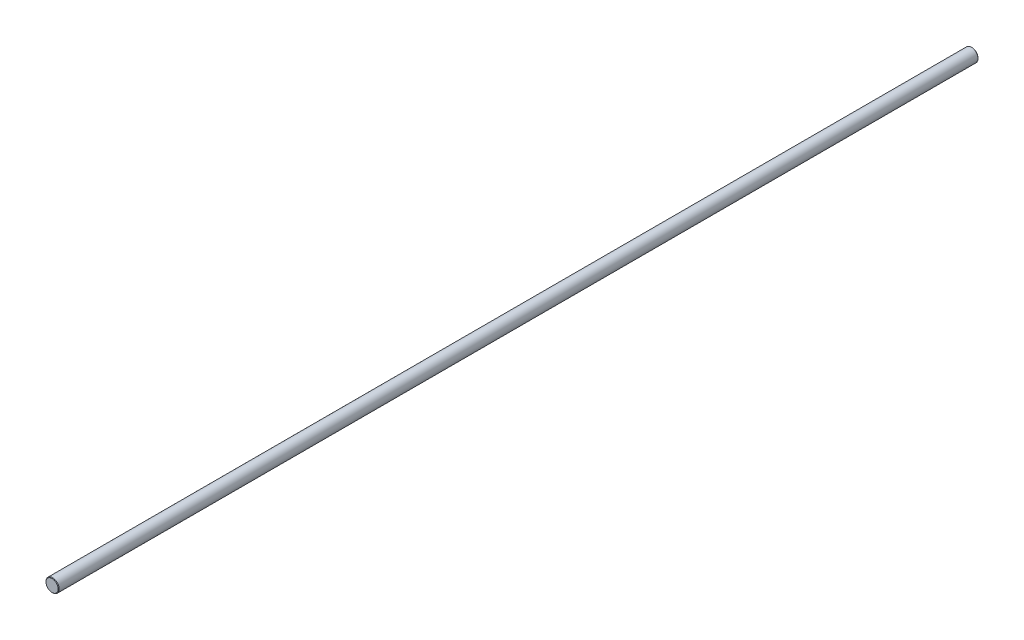
ISO-10303-21;
HEADER;
FILE_DESCRIPTION(('STEP AP214'),'2;1');
FILE_NAME('part.step','',(''),(''),'','','');
FILE_SCHEMA(('AUTOMOTIVE_DESIGN { 1 0 10303 214 1 1 1 1 }'));
ENDSEC;
DATA;
#1=APPLICATION_CONTEXT('core data for automotive mechanical design processes');
#2=APPLICATION_PROTOCOL_DEFINITION('international standard','automotive_design',2000,#1);
#3=PRODUCT_CONTEXT('',#1,'mechanical');
#4=PRODUCT('Part','Part','',(#3));
#5=PRODUCT_RELATED_PRODUCT_CATEGORY('part','',(#4));
#6=PRODUCT_DEFINITION_FORMATION('','',#4);
#7=PRODUCT_DEFINITION_CONTEXT('part definition',#1,'design');
#8=PRODUCT_DEFINITION('design','',#6,#7);
#9=PRODUCT_DEFINITION_SHAPE('','',#8);
#10=(LENGTH_UNIT() NAMED_UNIT(*) SI_UNIT(.MILLI.,.METRE.));
#11=(NAMED_UNIT(*) PLANE_ANGLE_UNIT() SI_UNIT($,.RADIAN.));
#12=(NAMED_UNIT(*) SI_UNIT($,.STERADIAN.) SOLID_ANGLE_UNIT());
#13=UNCERTAINTY_MEASURE_WITH_UNIT(LENGTH_MEASURE(1.E-05),#10,'distance_accuracy_value','');
#14=(GEOMETRIC_REPRESENTATION_CONTEXT(3) GLOBAL_UNCERTAINTY_ASSIGNED_CONTEXT((#13)) GLOBAL_UNIT_ASSIGNED_CONTEXT((#10,
#11,#12)) REPRESENTATION_CONTEXT('',''));
#15=CARTESIAN_POINT('',(0.,0.,0.));
#16=DIRECTION('',(0.,0.,1.));
#17=DIRECTION('',(1.,0.,0.));
#18=AXIS2_PLACEMENT_3D('',#15,#16,#17);
#19=CARTESIAN_POINT('',(0.,0.,698.5));
#20=DIRECTION('',(0.,0.,-1.));
#21=DIRECTION('',(-1.,0.,0.));
#22=AXIS2_PLACEMENT_3D('',#19,#20,#21);
#23=CYLINDRICAL_SURFACE('',#22,10.);
#24=CARTESIAN_POINT('',(0.,0.,-697.738));
#25=DIRECTION('',(0.,0.,1.));
#26=DIRECTION('',(1.,0.,0.));
#27=AXIS2_PLACEMENT_3D('',#24,#25,#26);
#28=CIRCLE('',#27,10.);
#29=CARTESIAN_POINT('',(10.,0.,-697.738));
#30=VERTEX_POINT('',#29);
#31=EDGE_CURVE('E41',#30,#30,#28,.T.);
#32=ORIENTED_EDGE('',*,*,#31,.T.);
#33=EDGE_LOOP('',(#32));
#34=FACE_BOUND('',#33,.T.);
#35=CARTESIAN_POINT('',(0.,0.,697.738));
#36=DIRECTION('',(0.,0.,1.));
#37=DIRECTION('',(1.,0.,0.));
#38=AXIS2_PLACEMENT_3D('',#35,#36,#37);
#39=CIRCLE('',#38,10.);
#40=CARTESIAN_POINT('',(10.,0.,697.738));
#41=VERTEX_POINT('',#40);
#42=EDGE_CURVE('E45',#41,#41,#39,.F.);
#43=ORIENTED_EDGE('',*,*,#42,.T.);
#44=EDGE_LOOP('',(#43));
#45=FACE_BOUND('',#44,.T.);
#46=ADVANCED_FACE('F30',(#34,#45),#23,.T.);
#47=CARTESIAN_POINT('',(0.,0.,698.5));
#48=DIRECTION('',(0.,0.,1.));
#49=DIRECTION('',(1.,0.,0.));
#50=AXIS2_PLACEMENT_3D('',#47,#48,#49);
#51=PLANE('',#50);
#52=CARTESIAN_POINT('',(0.,0.,698.5));
#53=DIRECTION('',(0.,0.,1.));
#54=DIRECTION('',(1.,0.,0.));
#55=AXIS2_PLACEMENT_3D('',#52,#53,#54);
#56=CIRCLE('',#55,9.23799999999997);
#57=CARTESIAN_POINT('',(9.23799999999997,0.,698.5));
#58=VERTEX_POINT('',#57);
#59=EDGE_CURVE('E10',#58,#58,#56,.T.);
#60=ORIENTED_EDGE('',*,*,#59,.T.);
#61=EDGE_LOOP('',(#60));
#62=FACE_BOUND('',#61,.T.);
#63=ADVANCED_FACE('F61',(#62),#51,.T.);
#64=CARTESIAN_POINT('',(0.,0.,-698.5));
#65=DIRECTION('',(0.,0.,1.));
#66=DIRECTION('',(1.,0.,0.));
#67=AXIS2_PLACEMENT_3D('',#64,#65,#66);
#68=PLANE('',#67);
#69=CARTESIAN_POINT('',(0.,0.,-698.5));
#70=DIRECTION('',(0.,0.,1.));
#71=DIRECTION('',(1.,0.,0.));
#72=AXIS2_PLACEMENT_3D('',#69,#70,#71);
#73=CIRCLE('',#72,9.23799999999986);
#74=CARTESIAN_POINT('',(9.23799999999986,0.,-698.5));
#75=VERTEX_POINT('',#74);
#76=EDGE_CURVE('E37',#75,#75,#73,.F.);
#77=ORIENTED_EDGE('',*,*,#76,.T.);
#78=EDGE_LOOP('',(#77));
#79=FACE_BOUND('',#78,.T.);
#80=ADVANCED_FACE('F58',(#79),#68,.F.);
#81=CARTESIAN_POINT('',(0.,0.,-697.738));
#82=DIRECTION('',(0.,0.,1.));
#83=DIRECTION('',(1.,0.,0.));
#84=AXIS2_PLACEMENT_3D('',#81,#82,#83);
#85=CONICAL_SURFACE('',#84,10.,0.785398163397443);
#86=ORIENTED_EDGE('',*,*,#76,.F.);
#87=EDGE_LOOP('',(#86));
#88=FACE_BOUND('',#87,.T.);
#89=ORIENTED_EDGE('',*,*,#31,.F.);
#90=EDGE_LOOP('',(#89));
#91=FACE_BOUND('',#90,.T.);
#92=ADVANCED_FACE('F54',(#88,#91),#85,.T.);
#93=CARTESIAN_POINT('',(0.,0.,698.5));
#94=DIRECTION('',(0.,0.,-1.));
#95=DIRECTION('',(-1.,0.,0.));
#96=AXIS2_PLACEMENT_3D('',#93,#94,#95);
#97=CONICAL_SURFACE('',#96,9.23799999999997,0.785398163397443);
#98=ORIENTED_EDGE('',*,*,#42,.F.);
#99=EDGE_LOOP('',(#98));
#100=FACE_BOUND('',#99,.T.);
#101=ORIENTED_EDGE('',*,*,#59,.F.);
#102=EDGE_LOOP('',(#101));
#103=FACE_BOUND('',#102,.T.);
#104=ADVANCED_FACE('F32',(#100,#103),#97,.T.);
#105=CLOSED_SHELL('',(#46,#63,#80,#92,#104));
#106=MANIFOLD_SOLID_BREP('B2',#105);
#107=ADVANCED_BREP_SHAPE_REPRESENTATION('',(#18,#106),#14);
#108=SHAPE_DEFINITION_REPRESENTATION(#9,#107);
ENDSEC;
END-ISO-10303-21;
